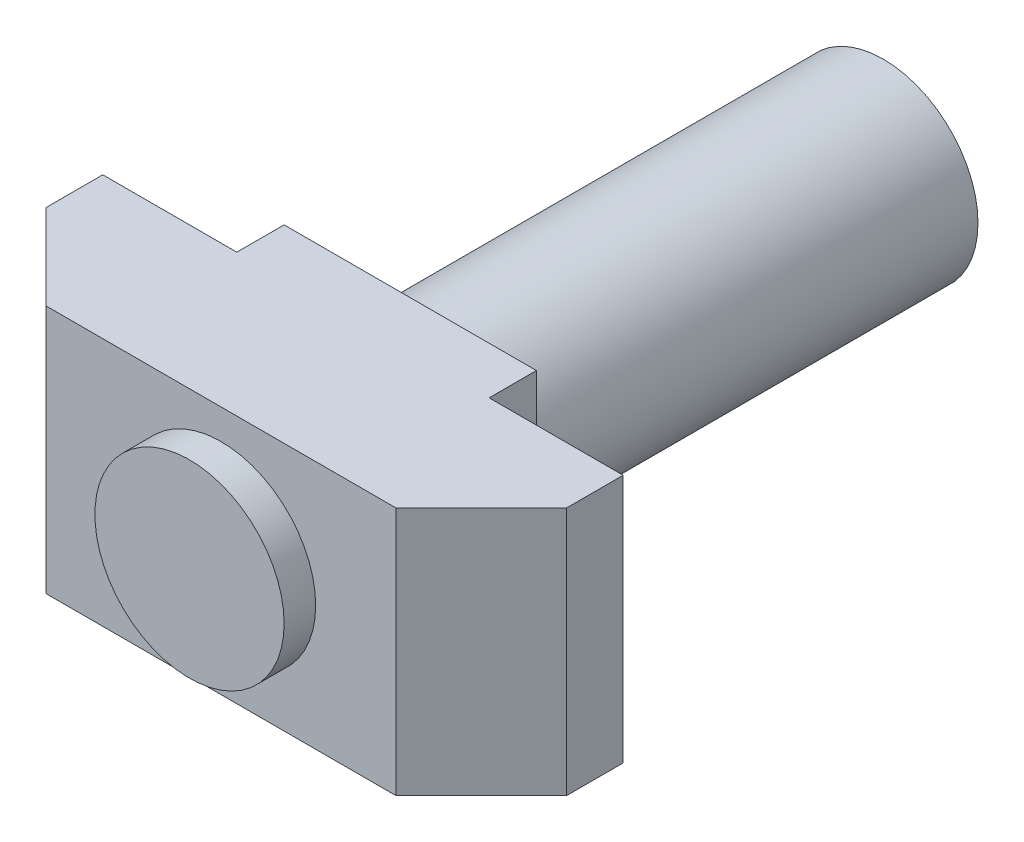
ISO-10303-21;
HEADER;
FILE_DESCRIPTION(('STEP AP214'),'2;1');
FILE_NAME('part.step','',(''),(''),'','','');
FILE_SCHEMA(('AUTOMOTIVE_DESIGN { 1 0 10303 214 1 1 1 1 }'));
ENDSEC;
DATA;
#1=APPLICATION_CONTEXT('core data for automotive mechanical design processes');
#2=APPLICATION_PROTOCOL_DEFINITION('international standard','automotive_design',2000,#1);
#3=PRODUCT_CONTEXT('',#1,'mechanical');
#4=PRODUCT('Part','Part','',(#3));
#5=PRODUCT_RELATED_PRODUCT_CATEGORY('part','',(#4));
#6=PRODUCT_DEFINITION_FORMATION('','',#4);
#7=PRODUCT_DEFINITION_CONTEXT('part definition',#1,'design');
#8=PRODUCT_DEFINITION('design','',#6,#7);
#9=PRODUCT_DEFINITION_SHAPE('','',#8);
#10=(LENGTH_UNIT() NAMED_UNIT(*) SI_UNIT(.MILLI.,.METRE.));
#11=(NAMED_UNIT(*) PLANE_ANGLE_UNIT() SI_UNIT($,.RADIAN.));
#12=(NAMED_UNIT(*) SI_UNIT($,.STERADIAN.) SOLID_ANGLE_UNIT());
#13=UNCERTAINTY_MEASURE_WITH_UNIT(LENGTH_MEASURE(1.E-05),#10,'distance_accuracy_value','');
#14=(GEOMETRIC_REPRESENTATION_CONTEXT(3) GLOBAL_UNCERTAINTY_ASSIGNED_CONTEXT((#13)) GLOBAL_UNIT_ASSIGNED_CONTEXT((#10,
#11,#12)) REPRESENTATION_CONTEXT('',''));
#15=CARTESIAN_POINT('',(0.,0.,0.));
#16=DIRECTION('',(0.,0.,1.));
#17=DIRECTION('',(1.,0.,0.));
#18=AXIS2_PLACEMENT_3D('',#15,#16,#17);
#19=CARTESIAN_POINT('',(0.,0.,22.));
#20=DIRECTION('',(0.,0.,-1.));
#21=DIRECTION('',(-1.,0.,0.));
#22=AXIS2_PLACEMENT_3D('',#19,#20,#21);
#23=CYLINDRICAL_SURFACE('',#22,3.);
#24=CARTESIAN_POINT('',(0.,0.,21.));
#25=DIRECTION('',(0.,0.,1.));
#26=DIRECTION('',(1.,0.,0.));
#27=AXIS2_PLACEMENT_3D('',#24,#25,#26);
#28=CIRCLE('',#27,3.);
#29=CARTESIAN_POINT('',(3.,0.,21.));
#30=VERTEX_POINT('',#29);
#31=EDGE_CURVE('E51',#30,#30,#28,.T.);
#32=ORIENTED_EDGE('',*,*,#31,.T.);
#33=EDGE_LOOP('',(#32));
#34=FACE_BOUND('',#33,.T.);
#35=CARTESIAN_POINT('',(0.,0.,22.));
#36=DIRECTION('',(0.,0.,1.));
#37=DIRECTION('',(1.,0.,0.));
#38=AXIS2_PLACEMENT_3D('',#35,#36,#37);
#39=CIRCLE('',#38,3.);
#40=CARTESIAN_POINT('',(3.,0.,22.));
#41=VERTEX_POINT('',#40);
#42=EDGE_CURVE('E13',#41,#41,#39,.T.);
#43=ORIENTED_EDGE('',*,*,#42,.F.);
#44=EDGE_LOOP('',(#43));
#45=FACE_BOUND('',#44,.T.);
#46=ADVANCED_FACE('F47',(#34,#45),#23,.T.);
#47=CARTESIAN_POINT('',(0.,0.,22.));
#48=DIRECTION('',(0.,0.,1.));
#49=DIRECTION('',(1.,0.,0.));
#50=AXIS2_PLACEMENT_3D('',#47,#48,#49);
#51=PLANE('',#50);
#52=ORIENTED_EDGE('',*,*,#42,.T.);
#53=EDGE_LOOP('',(#52));
#54=FACE_BOUND('',#53,.T.);
#55=ADVANCED_FACE('F262',(#54),#51,.T.);
#56=CARTESIAN_POINT('',(-5.55,3.95,21.));
#57=DIRECTION('',(-0.707106781186547,0.,0.707106781186548));
#58=DIRECTION('',(0.707106781186548,0.,0.707106781186547));
#59=AXIS2_PLACEMENT_3D('',#56,#57,#58);
#60=PLANE('',#59);
#61=DIRECTION('',(-0.707106781186548,0.,-0.707106781186547));
#62=VECTOR('',#61,1.);
#63=CARTESIAN_POINT('',(-5.55,-3.94999999999999,21.));
#64=LINE('',#63,#62);
#65=CARTESIAN_POINT('',(-5.55,-3.94999999999999,21.));
#66=VERTEX_POINT('',#65);
#67=CARTESIAN_POINT('',(-8.25000000000001,-3.95,18.3));
#68=VERTEX_POINT('',#67);
#69=EDGE_CURVE('E161',#66,#68,#64,.T.);
#70=ORIENTED_EDGE('',*,*,#69,.F.);
#71=DIRECTION('',(0.,-1.,0.));
#72=VECTOR('',#71,1.);
#73=CARTESIAN_POINT('',(-5.55,3.95,21.));
#74=LINE('',#73,#72);
#75=CARTESIAN_POINT('',(-5.55,3.95,21.));
#76=VERTEX_POINT('',#75);
#77=EDGE_CURVE('E66',#76,#66,#74,.T.);
#78=ORIENTED_EDGE('',*,*,#77,.F.);
#79=DIRECTION('',(-0.707106781186548,0.,-0.707106781186547));
#80=VECTOR('',#79,1.);
#81=CARTESIAN_POINT('',(-5.55,3.95,21.));
#82=LINE('',#81,#80);
#83=CARTESIAN_POINT('',(-8.25000000000001,3.95,18.3));
#84=VERTEX_POINT('',#83);
#85=EDGE_CURVE('E188',#76,#84,#82,.T.);
#86=ORIENTED_EDGE('',*,*,#85,.T.);
#87=DIRECTION('',(0.,-1.,0.));
#88=VECTOR('',#87,1.);
#89=CARTESIAN_POINT('',(-8.25000000000001,3.95,18.3));
#90=LINE('',#89,#88);
#91=EDGE_CURVE('E113',#84,#68,#90,.T.);
#92=ORIENTED_EDGE('',*,*,#91,.T.);
#93=EDGE_LOOP('',(#70,#78,#86,#92));
#94=FACE_BOUND('',#93,.T.);
#95=ADVANCED_FACE('F215',(#94),#60,.T.);
#96=CARTESIAN_POINT('',(5.55,3.95,21.));
#97=DIRECTION('',(0.,0.,1.));
#98=DIRECTION('',(1.,0.,0.));
#99=AXIS2_PLACEMENT_3D('',#96,#97,#98);
#100=PLANE('',#99);
#101=ORIENTED_EDGE('',*,*,#31,.F.);
#102=EDGE_LOOP('',(#101));
#103=FACE_BOUND('',#102,.T.);
#104=DIRECTION('',(-1.,0.,0.));
#105=VECTOR('',#104,1.);
#106=CARTESIAN_POINT('',(5.55,-3.95,21.));
#107=LINE('',#106,#105);
#108=CARTESIAN_POINT('',(5.55,-3.95,21.));
#109=VERTEX_POINT('',#108);
#110=EDGE_CURVE('E185',#109,#66,#107,.T.);
#111=ORIENTED_EDGE('',*,*,#110,.F.);
#112=DIRECTION('',(0.,-1.,0.));
#113=VECTOR('',#112,1.);
#114=CARTESIAN_POINT('',(5.55,3.95,21.));
#115=LINE('',#114,#113);
#116=CARTESIAN_POINT('',(5.55,3.95,21.));
#117=VERTEX_POINT('',#116);
#118=EDGE_CURVE('E101',#117,#109,#115,.T.);
#119=ORIENTED_EDGE('',*,*,#118,.F.);
#120=DIRECTION('',(-1.,0.,0.));
#121=VECTOR('',#120,1.);
#122=CARTESIAN_POINT('',(5.55,3.95,21.));
#123=LINE('',#122,#121);
#124=EDGE_CURVE('E151',#117,#76,#123,.T.);
#125=ORIENTED_EDGE('',*,*,#124,.T.);
#126=ORIENTED_EDGE('',*,*,#77,.T.);
#127=EDGE_LOOP('',(#111,#119,#125,#126));
#128=FACE_BOUND('',#127,.T.);
#129=ADVANCED_FACE('F213',(#103,#128),#100,.T.);
#130=CARTESIAN_POINT('',(8.24999999999998,3.95,18.3));
#131=DIRECTION('',(0.707106781186548,0.,0.707106781186547));
#132=DIRECTION('',(0.707106781186547,0.,-0.707106781186548));
#133=AXIS2_PLACEMENT_3D('',#130,#131,#132);
#134=PLANE('',#133);
#135=DIRECTION('',(-0.707106781186547,0.,0.707106781186548));
#136=VECTOR('',#135,1.);
#137=CARTESIAN_POINT('',(8.24999999999998,-3.95,18.3));
#138=LINE('',#137,#136);
#139=CARTESIAN_POINT('',(8.24999999999998,-3.95,18.3));
#140=VERTEX_POINT('',#139);
#141=EDGE_CURVE('E138',#140,#109,#138,.T.);
#142=ORIENTED_EDGE('',*,*,#141,.F.);
#143=DIRECTION('',(0.,-1.,0.));
#144=VECTOR('',#143,1.);
#145=CARTESIAN_POINT('',(8.24999999999998,3.95,18.3));
#146=LINE('',#145,#144);
#147=CARTESIAN_POINT('',(8.24999999999998,3.95,18.3));
#148=VERTEX_POINT('',#147);
#149=EDGE_CURVE('E133',#148,#140,#146,.T.);
#150=ORIENTED_EDGE('',*,*,#149,.F.);
#151=DIRECTION('',(-0.707106781186547,0.,0.707106781186548));
#152=VECTOR('',#151,1.);
#153=CARTESIAN_POINT('',(8.24999999999998,3.95,18.3));
#154=LINE('',#153,#152);
#155=EDGE_CURVE('E136',#148,#117,#154,.T.);
#156=ORIENTED_EDGE('',*,*,#155,.T.);
#157=ORIENTED_EDGE('',*,*,#118,.T.);
#158=EDGE_LOOP('',(#142,#150,#156,#157));
#159=FACE_BOUND('',#158,.T.);
#160=ADVANCED_FACE('F135',(#159),#134,.T.);
#161=CARTESIAN_POINT('',(8.24999999999998,3.95,16.5));
#162=DIRECTION('',(1.,0.,0.));
#163=DIRECTION('',(0.,0.,-1.));
#164=AXIS2_PLACEMENT_3D('',#161,#162,#163);
#165=PLANE('',#164);
#166=DIRECTION('',(0.,0.,1.));
#167=VECTOR('',#166,1.);
#168=CARTESIAN_POINT('',(8.24999999999998,-3.94999999999999,16.5));
#169=LINE('',#168,#167);
#170=CARTESIAN_POINT('',(8.24999999999998,-3.94999999999999,16.5));
#171=VERTEX_POINT('',#170);
#172=EDGE_CURVE('E182',#171,#140,#169,.T.);
#173=ORIENTED_EDGE('',*,*,#172,.F.);
#174=DIRECTION('',(0.,-1.,0.));
#175=VECTOR('',#174,1.);
#176=CARTESIAN_POINT('',(8.24999999999998,3.95,16.5));
#177=LINE('',#176,#175);
#178=CARTESIAN_POINT('',(8.24999999999998,3.95,16.5));
#179=VERTEX_POINT('',#178);
#180=EDGE_CURVE('E143',#179,#171,#177,.T.);
#181=ORIENTED_EDGE('',*,*,#180,.F.);
#182=DIRECTION('',(0.,0.,1.));
#183=VECTOR('',#182,1.);
#184=CARTESIAN_POINT('',(8.24999999999998,3.95,16.5));
#185=LINE('',#184,#183);
#186=EDGE_CURVE('E149',#179,#148,#185,.T.);
#187=ORIENTED_EDGE('',*,*,#186,.T.);
#188=ORIENTED_EDGE('',*,*,#149,.T.);
#189=EDGE_LOOP('',(#173,#181,#187,#188));
#190=FACE_BOUND('',#189,.T.);
#191=ADVANCED_FACE('F153',(#190),#165,.T.);
#192=CARTESIAN_POINT('',(4.,3.95,16.5));
#193=DIRECTION('',(0.,0.,-1.));
#194=DIRECTION('',(-1.,0.,0.));
#195=AXIS2_PLACEMENT_3D('',#192,#193,#194);
#196=PLANE('',#195);
#197=DIRECTION('',(1.,0.,0.));
#198=VECTOR('',#197,1.);
#199=CARTESIAN_POINT('',(4.,-3.95,16.5));
#200=LINE('',#199,#198);
#201=CARTESIAN_POINT('',(4.,-3.95,16.5));
#202=VERTEX_POINT('',#201);
#203=EDGE_CURVE('E179',#202,#171,#200,.T.);
#204=ORIENTED_EDGE('',*,*,#203,.F.);
#205=DIRECTION('',(0.,-1.,0.));
#206=VECTOR('',#205,1.);
#207=CARTESIAN_POINT('',(4.,3.95,16.5));
#208=LINE('',#207,#206);
#209=CARTESIAN_POINT('',(4.,3.95,16.5));
#210=VERTEX_POINT('',#209);
#211=EDGE_CURVE('E193',#210,#202,#208,.T.);
#212=ORIENTED_EDGE('',*,*,#211,.F.);
#213=DIRECTION('',(1.,0.,0.));
#214=VECTOR('',#213,1.);
#215=CARTESIAN_POINT('',(4.,3.95,16.5));
#216=LINE('',#215,#214);
#217=EDGE_CURVE('E154',#210,#179,#216,.T.);
#218=ORIENTED_EDGE('',*,*,#217,.T.);
#219=ORIENTED_EDGE('',*,*,#180,.T.);
#220=EDGE_LOOP('',(#204,#212,#218,#219));
#221=FACE_BOUND('',#220,.T.);
#222=ADVANCED_FACE('F222',(#221),#196,.T.);
#223=CARTESIAN_POINT('',(4.,3.95,15.));
#224=DIRECTION('',(1.,0.,0.));
#225=DIRECTION('',(0.,0.,-1.));
#226=AXIS2_PLACEMENT_3D('',#223,#224,#225);
#227=PLANE('',#226);
#228=DIRECTION('',(0.,0.,1.));
#229=VECTOR('',#228,1.);
#230=CARTESIAN_POINT('',(4.,-3.95,15.));
#231=LINE('',#230,#229);
#232=CARTESIAN_POINT('',(4.,-3.95,15.));
#233=VERTEX_POINT('',#232);
#234=EDGE_CURVE('E176',#233,#202,#231,.T.);
#235=ORIENTED_EDGE('',*,*,#234,.F.);
#236=DIRECTION('',(0.,-1.,0.));
#237=VECTOR('',#236,1.);
#238=CARTESIAN_POINT('',(4.,3.95,15.));
#239=LINE('',#238,#237);
#240=CARTESIAN_POINT('',(4.,3.95,15.));
#241=VERTEX_POINT('',#240);
#242=EDGE_CURVE('E195',#241,#233,#239,.T.);
#243=ORIENTED_EDGE('',*,*,#242,.F.);
#244=DIRECTION('',(0.,0.,1.));
#245=VECTOR('',#244,1.);
#246=CARTESIAN_POINT('',(4.,3.95,15.));
#247=LINE('',#246,#245);
#248=EDGE_CURVE('E156',#241,#210,#247,.T.);
#249=ORIENTED_EDGE('',*,*,#248,.T.);
#250=ORIENTED_EDGE('',*,*,#211,.T.);
#251=EDGE_LOOP('',(#235,#243,#249,#250));
#252=FACE_BOUND('',#251,.T.);
#253=ADVANCED_FACE('F228',(#252),#227,.T.);
#254=CARTESIAN_POINT('',(-4.,3.95,15.));
#255=DIRECTION('',(0.,0.,-1.));
#256=DIRECTION('',(-1.,0.,0.));
#257=AXIS2_PLACEMENT_3D('',#254,#255,#256);
#258=PLANE('',#257);
#259=CARTESIAN_POINT('',(0.,0.,15.));
#260=DIRECTION('',(0.,0.,-1.));
#261=DIRECTION('',(-1.,0.,0.));
#262=AXIS2_PLACEMENT_3D('',#259,#260,#261);
#263=CIRCLE('',#262,3.);
#264=CARTESIAN_POINT('',(-3.,0.,15.));
#265=VERTEX_POINT('',#264);
#266=EDGE_CURVE('E190',#265,#265,#263,.T.);
#267=ORIENTED_EDGE('',*,*,#266,.F.);
#268=EDGE_LOOP('',(#267));
#269=FACE_BOUND('',#268,.T.);
#270=DIRECTION('',(1.,0.,0.));
#271=VECTOR('',#270,1.);
#272=CARTESIAN_POINT('',(-4.,-3.95,15.));
#273=LINE('',#272,#271);
#274=CARTESIAN_POINT('',(-4.,-3.95,15.));
#275=VERTEX_POINT('',#274);
#276=EDGE_CURVE('E173',#275,#233,#273,.T.);
#277=ORIENTED_EDGE('',*,*,#276,.F.);
#278=DIRECTION('',(0.,-1.,0.));
#279=VECTOR('',#278,1.);
#280=CARTESIAN_POINT('',(-4.,3.95,15.));
#281=LINE('',#280,#279);
#282=CARTESIAN_POINT('',(-4.,3.95,15.));
#283=VERTEX_POINT('',#282);
#284=EDGE_CURVE('E197',#283,#275,#281,.T.);
#285=ORIENTED_EDGE('',*,*,#284,.F.);
#286=DIRECTION('',(1.,0.,0.));
#287=VECTOR('',#286,1.);
#288=CARTESIAN_POINT('',(-4.,3.95,15.));
#289=LINE('',#288,#287);
#290=EDGE_CURVE('E229',#283,#241,#289,.T.);
#291=ORIENTED_EDGE('',*,*,#290,.T.);
#292=ORIENTED_EDGE('',*,*,#242,.T.);
#293=EDGE_LOOP('',(#277,#285,#291,#292));
#294=FACE_BOUND('',#293,.T.);
#295=ADVANCED_FACE('F251',(#269,#294),#258,.T.);
#296=CARTESIAN_POINT('',(-4.,3.95000000000001,16.5));
#297=DIRECTION('',(-1.,0.,0.));
#298=DIRECTION('',(0.,0.,1.));
#299=AXIS2_PLACEMENT_3D('',#296,#297,#298);
#300=PLANE('',#299);
#301=DIRECTION('',(0.,0.,-1.));
#302=VECTOR('',#301,1.);
#303=CARTESIAN_POINT('',(-4.,-3.94999999999999,16.5));
#304=LINE('',#303,#302);
#305=CARTESIAN_POINT('',(-4.,-3.94999999999999,16.5));
#306=VERTEX_POINT('',#305);
#307=EDGE_CURVE('E170',#306,#275,#304,.T.);
#308=ORIENTED_EDGE('',*,*,#307,.F.);
#309=DIRECTION('',(0.,-1.,0.));
#310=VECTOR('',#309,1.);
#311=CARTESIAN_POINT('',(-4.,3.95000000000001,16.5));
#312=LINE('',#311,#310);
#313=CARTESIAN_POINT('',(-4.,3.95000000000001,16.5));
#314=VERTEX_POINT('',#313);
#315=EDGE_CURVE('E199',#314,#306,#312,.T.);
#316=ORIENTED_EDGE('',*,*,#315,.F.);
#317=DIRECTION('',(0.,0.,-1.));
#318=VECTOR('',#317,1.);
#319=CARTESIAN_POINT('',(-4.,3.95000000000001,16.5));
#320=LINE('',#319,#318);
#321=EDGE_CURVE('E230',#314,#283,#320,.T.);
#322=ORIENTED_EDGE('',*,*,#321,.T.);
#323=ORIENTED_EDGE('',*,*,#284,.T.);
#324=EDGE_LOOP('',(#308,#316,#322,#323));
#325=FACE_BOUND('',#324,.T.);
#326=ADVANCED_FACE('F249',(#325),#300,.T.);
#327=CARTESIAN_POINT('',(-8.25000000000001,3.95,16.5));
#328=DIRECTION('',(0.,0.,-1.));
#329=DIRECTION('',(-1.,0.,0.));
#330=AXIS2_PLACEMENT_3D('',#327,#328,#329);
#331=PLANE('',#330);
#332=DIRECTION('',(1.,0.,0.));
#333=VECTOR('',#332,1.);
#334=CARTESIAN_POINT('',(-8.25000000000001,-3.95,16.5));
#335=LINE('',#334,#333);
#336=CARTESIAN_POINT('',(-8.25000000000001,-3.95,16.5));
#337=VERTEX_POINT('',#336);
#338=EDGE_CURVE('E167',#337,#306,#335,.T.);
#339=ORIENTED_EDGE('',*,*,#338,.F.);
#340=DIRECTION('',(0.,-1.,0.));
#341=VECTOR('',#340,1.);
#342=CARTESIAN_POINT('',(-8.25000000000001,3.95,16.5));
#343=LINE('',#342,#341);
#344=CARTESIAN_POINT('',(-8.25000000000001,3.95,16.5));
#345=VERTEX_POINT('',#344);
#346=EDGE_CURVE('E201',#345,#337,#343,.T.);
#347=ORIENTED_EDGE('',*,*,#346,.F.);
#348=DIRECTION('',(1.,0.,0.));
#349=VECTOR('',#348,1.);
#350=CARTESIAN_POINT('',(-8.25000000000001,3.95,16.5));
#351=LINE('',#350,#349);
#352=EDGE_CURVE('E235',#345,#314,#351,.T.);
#353=ORIENTED_EDGE('',*,*,#352,.T.);
#354=ORIENTED_EDGE('',*,*,#315,.T.);
#355=EDGE_LOOP('',(#339,#347,#353,#354));
#356=FACE_BOUND('',#355,.T.);
#357=ADVANCED_FACE('F245',(#356),#331,.T.);
#358=CARTESIAN_POINT('',(-8.25000000000001,3.95,18.3));
#359=DIRECTION('',(-1.,0.,0.));
#360=DIRECTION('',(0.,0.,1.));
#361=AXIS2_PLACEMENT_3D('',#358,#359,#360);
#362=PLANE('',#361);
#363=DIRECTION('',(0.,0.,-1.));
#364=VECTOR('',#363,1.);
#365=CARTESIAN_POINT('',(-8.25000000000001,-3.95,18.3));
#366=LINE('',#365,#364);
#367=EDGE_CURVE('E164',#68,#337,#366,.T.);
#368=ORIENTED_EDGE('',*,*,#367,.F.);
#369=ORIENTED_EDGE('',*,*,#91,.F.);
#370=DIRECTION('',(0.,0.,-1.));
#371=VECTOR('',#370,1.);
#372=CARTESIAN_POINT('',(-8.25000000000001,3.95,18.3));
#373=LINE('',#372,#371);
#374=EDGE_CURVE('E238',#84,#345,#373,.T.);
#375=ORIENTED_EDGE('',*,*,#374,.T.);
#376=ORIENTED_EDGE('',*,*,#346,.T.);
#377=EDGE_LOOP('',(#368,#369,#375,#376));
#378=FACE_BOUND('',#377,.T.);
#379=ADVANCED_FACE('F242',(#378),#362,.T.);
#380=CARTESIAN_POINT('',(0.,3.95,0.));
#381=DIRECTION('',(0.,1.,0.));
#382=DIRECTION('',(0.,0.,1.));
#383=AXIS2_PLACEMENT_3D('',#380,#381,#382);
#384=PLANE('',#383);
#385=ORIENTED_EDGE('',*,*,#85,.F.);
#386=ORIENTED_EDGE('',*,*,#124,.F.);
#387=ORIENTED_EDGE('',*,*,#155,.F.);
#388=ORIENTED_EDGE('',*,*,#186,.F.);
#389=ORIENTED_EDGE('',*,*,#217,.F.);
#390=ORIENTED_EDGE('',*,*,#248,.F.);
#391=ORIENTED_EDGE('',*,*,#290,.F.);
#392=ORIENTED_EDGE('',*,*,#321,.F.);
#393=ORIENTED_EDGE('',*,*,#352,.F.);
#394=ORIENTED_EDGE('',*,*,#374,.F.);
#395=EDGE_LOOP('',(#385,#386,#387,#388,#389,#390,#391,#392,#393,#394));
#396=FACE_BOUND('',#395,.T.);
#397=ADVANCED_FACE('F147',(#396),#384,.T.);
#398=CARTESIAN_POINT('',(0.,-3.95,0.));
#399=DIRECTION('',(0.,1.,0.));
#400=DIRECTION('',(0.,0.,1.));
#401=AXIS2_PLACEMENT_3D('',#398,#399,#400);
#402=PLANE('',#401);
#403=ORIENTED_EDGE('',*,*,#69,.T.);
#404=ORIENTED_EDGE('',*,*,#367,.T.);
#405=ORIENTED_EDGE('',*,*,#338,.T.);
#406=ORIENTED_EDGE('',*,*,#307,.T.);
#407=ORIENTED_EDGE('',*,*,#276,.T.);
#408=ORIENTED_EDGE('',*,*,#234,.T.);
#409=ORIENTED_EDGE('',*,*,#203,.T.);
#410=ORIENTED_EDGE('',*,*,#172,.T.);
#411=ORIENTED_EDGE('',*,*,#141,.T.);
#412=ORIENTED_EDGE('',*,*,#110,.T.);
#413=EDGE_LOOP('',(#403,#404,#405,#406,#407,#408,#409,#410,#411,#412));
#414=FACE_BOUND('',#413,.T.);
#415=ADVANCED_FACE('F218',(#414),#402,.F.);
#416=CARTESIAN_POINT('',(0.,0.,0.));
#417=DIRECTION('',(0.,0.,1.));
#418=DIRECTION('',(1.,0.,0.));
#419=AXIS2_PLACEMENT_3D('',#416,#417,#418);
#420=PLANE('',#419);
#421=CARTESIAN_POINT('',(0.,0.,0.));
#422=DIRECTION('',(0.,0.,1.));
#423=DIRECTION('',(1.,0.,0.));
#424=AXIS2_PLACEMENT_3D('',#421,#422,#423);
#425=CIRCLE('',#424,3.);
#426=CARTESIAN_POINT('',(3.,0.,0.));
#427=VERTEX_POINT('',#426);
#428=EDGE_CURVE('E57',#427,#427,#425,.T.);
#429=ORIENTED_EDGE('',*,*,#428,.F.);
#430=EDGE_LOOP('',(#429));
#431=FACE_BOUND('',#430,.T.);
#432=ADVANCED_FACE('F269',(#431),#420,.F.);
#433=ORIENTED_EDGE('',*,*,#266,.T.);
#434=EDGE_LOOP('',(#433));
#435=FACE_BOUND('',#434,.T.);
#436=ORIENTED_EDGE('',*,*,#428,.T.);
#437=EDGE_LOOP('',(#436));
#438=FACE_BOUND('',#437,.T.);
#439=ADVANCED_FACE('F49',(#435,#438),#23,.T.);
#440=CLOSED_SHELL('',(#46,#55,#95,#129,#160,#191,#222,#253,#295,#326,#357,#379,#397,#415,#432,#439));
#441=MANIFOLD_SOLID_BREP('B2',#440);
#442=ADVANCED_BREP_SHAPE_REPRESENTATION('',(#18,#441),#14);
#443=SHAPE_DEFINITION_REPRESENTATION(#9,#442);
ENDSEC;
END-ISO-10303-21;
